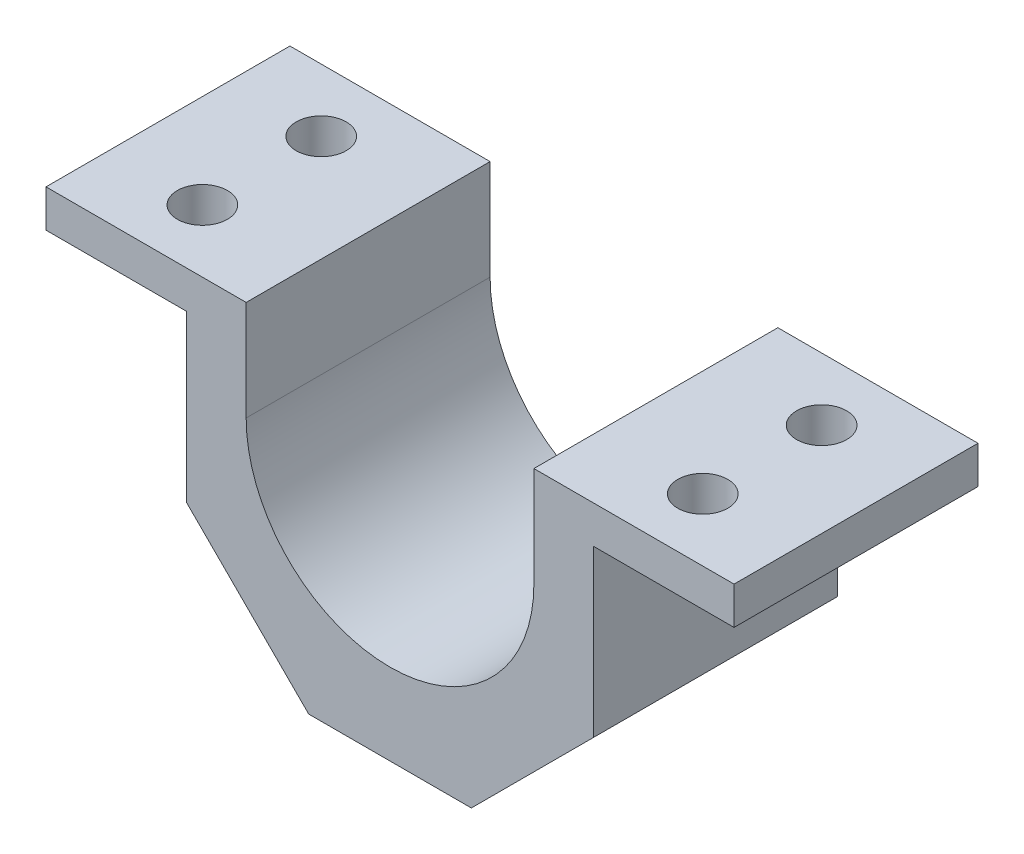
ISO-10303-21;
HEADER;
FILE_DESCRIPTION(('STEP AP214'),'2;1');
FILE_NAME('part.step','',(''),(''),'','','');
FILE_SCHEMA(('AUTOMOTIVE_DESIGN { 1 0 10303 214 1 1 1 1 }'));
ENDSEC;
DATA;
#1=APPLICATION_CONTEXT('core data for automotive mechanical design processes');
#2=APPLICATION_PROTOCOL_DEFINITION('international standard','automotive_design',2000,#1);
#3=PRODUCT_CONTEXT('',#1,'mechanical');
#4=PRODUCT('Part','Part','',(#3));
#5=PRODUCT_RELATED_PRODUCT_CATEGORY('part','',(#4));
#6=PRODUCT_DEFINITION_FORMATION('','',#4);
#7=PRODUCT_DEFINITION_CONTEXT('part definition',#1,'design');
#8=PRODUCT_DEFINITION('design','',#6,#7);
#9=PRODUCT_DEFINITION_SHAPE('','',#8);
#10=(LENGTH_UNIT() NAMED_UNIT(*) SI_UNIT(.MILLI.,.METRE.));
#11=(NAMED_UNIT(*) PLANE_ANGLE_UNIT() SI_UNIT($,.RADIAN.));
#12=(NAMED_UNIT(*) SI_UNIT($,.STERADIAN.) SOLID_ANGLE_UNIT());
#13=UNCERTAINTY_MEASURE_WITH_UNIT(LENGTH_MEASURE(1.E-05),#10,'distance_accuracy_value','');
#14=(GEOMETRIC_REPRESENTATION_CONTEXT(3) GLOBAL_UNCERTAINTY_ASSIGNED_CONTEXT((#13)) GLOBAL_UNIT_ASSIGNED_CONTEXT((#10,
#11,#12)) REPRESENTATION_CONTEXT('',''));
#15=CARTESIAN_POINT('',(0.,0.,0.));
#16=DIRECTION('',(0.,0.,1.));
#17=DIRECTION('',(1.,0.,0.));
#18=AXIS2_PLACEMENT_3D('',#15,#16,#17);
#19=CARTESIAN_POINT('',(0.,0.,19.5));
#20=DIRECTION('',(0.,0.,-1.));
#21=DIRECTION('',(-1.,0.,0.));
#22=AXIS2_PLACEMENT_3D('',#19,#20,#21);
#23=CYLINDRICAL_SURFACE('',#22,23.);
#24=CARTESIAN_POINT('',(0.,0.,-19.5));
#25=DIRECTION('',(0.,0.,1.));
#26=DIRECTION('',(1.,0.,0.));
#27=AXIS2_PLACEMENT_3D('',#24,#25,#26);
#28=CIRCLE('',#27,23.);
#29=CARTESIAN_POINT('',(-23.,0.,-19.5));
#30=VERTEX_POINT('',#29);
#31=CARTESIAN_POINT('',(23.,0.,-19.5));
#32=VERTEX_POINT('',#31);
#33=EDGE_CURVE('E166',#30,#32,#28,.T.);
#34=ORIENTED_EDGE('',*,*,#33,.F.);
#35=DIRECTION('',(0.,0.,-1.));
#36=VECTOR('',#35,1.);
#37=CARTESIAN_POINT('',(-23.,0.,19.5));
#38=LINE('',#37,#36);
#39=CARTESIAN_POINT('',(-23.,0.,19.5));
#40=VERTEX_POINT('',#39);
#41=EDGE_CURVE('E11',#40,#30,#38,.T.);
#42=ORIENTED_EDGE('',*,*,#41,.F.);
#43=CARTESIAN_POINT('',(0.,0.,19.5));
#44=DIRECTION('',(0.,0.,1.));
#45=DIRECTION('',(1.,0.,0.));
#46=AXIS2_PLACEMENT_3D('',#43,#44,#45);
#47=CIRCLE('',#46,23.);
#48=CARTESIAN_POINT('',(23.,0.,19.5));
#49=VERTEX_POINT('',#48);
#50=EDGE_CURVE('E199',#40,#49,#47,.T.);
#51=ORIENTED_EDGE('',*,*,#50,.T.);
#52=DIRECTION('',(0.,0.,-1.));
#53=VECTOR('',#52,1.);
#54=CARTESIAN_POINT('',(23.,0.,19.5));
#55=LINE('',#54,#53);
#56=EDGE_CURVE('E109',#49,#32,#55,.T.);
#57=ORIENTED_EDGE('',*,*,#56,.T.);
#58=EDGE_LOOP('',(#34,#42,#51,#57));
#59=FACE_BOUND('',#58,.T.);
#60=ADVANCED_FACE('F39',(#59),#23,.F.);
#61=CARTESIAN_POINT('',(-23.,0.,19.5));
#62=DIRECTION('',(1.,0.,0.));
#63=DIRECTION('',(0.,0.,-1.));
#64=AXIS2_PLACEMENT_3D('',#61,#62,#63);
#65=PLANE('',#64);
#66=DIRECTION('',(0.,-1.,0.));
#67=VECTOR('',#66,1.);
#68=CARTESIAN_POINT('',(-23.,0.,-19.5));
#69=LINE('',#68,#67);
#70=CARTESIAN_POINT('',(-23.,16.,-19.5));
#71=VERTEX_POINT('',#70);
#72=EDGE_CURVE('E171',#71,#30,#69,.T.);
#73=ORIENTED_EDGE('',*,*,#72,.F.);
#74=DIRECTION('',(0.,0.,-1.));
#75=VECTOR('',#74,1.);
#76=CARTESIAN_POINT('',(-23.,16.,19.5));
#77=LINE('',#76,#75);
#78=CARTESIAN_POINT('',(-23.,16.,19.5));
#79=VERTEX_POINT('',#78);
#80=EDGE_CURVE('E48',#79,#71,#77,.T.);
#81=ORIENTED_EDGE('',*,*,#80,.F.);
#82=DIRECTION('',(0.,-1.,0.));
#83=VECTOR('',#82,1.);
#84=CARTESIAN_POINT('',(-23.,0.,19.5));
#85=LINE('',#84,#83);
#86=EDGE_CURVE('E241',#79,#40,#85,.T.);
#87=ORIENTED_EDGE('',*,*,#86,.T.);
#88=ORIENTED_EDGE('',*,*,#41,.T.);
#89=EDGE_LOOP('',(#73,#81,#87,#88));
#90=FACE_BOUND('',#89,.T.);
#91=ADVANCED_FACE('F278',(#90),#65,.T.);
#92=CARTESIAN_POINT('',(0.,16.,19.5));
#93=DIRECTION('',(0.,1.,0.));
#94=DIRECTION('',(-1.,0.,0.));
#95=AXIS2_PLACEMENT_3D('',#92,#93,#94);
#96=PLANE('',#95);
#97=CARTESIAN_POINT('',(-40.,16.,-9.5));
#98=DIRECTION('',(0.,1.,0.));
#99=DIRECTION('',(1.,0.,0.));
#100=AXIS2_PLACEMENT_3D('',#97,#98,#99);
#101=CIRCLE('',#100,4.00000000000001);
#102=CARTESIAN_POINT('',(-36.,16.,-9.5));
#103=VERTEX_POINT('',#102);
#104=EDGE_CURVE('E454',#103,#103,#101,.T.);
#105=ORIENTED_EDGE('',*,*,#104,.F.);
#106=EDGE_LOOP('',(#105));
#107=FACE_BOUND('',#106,.T.);
#108=CARTESIAN_POINT('',(-40.,16.,9.5));
#109=DIRECTION('',(0.,1.,0.));
#110=DIRECTION('',(-1.,0.,0.));
#111=AXIS2_PLACEMENT_3D('',#108,#109,#110);
#112=CIRCLE('',#111,4.00000000000001);
#113=CARTESIAN_POINT('',(-44.,16.,9.5));
#114=VERTEX_POINT('',#113);
#115=EDGE_CURVE('E459',#114,#114,#112,.T.);
#116=ORIENTED_EDGE('',*,*,#115,.F.);
#117=EDGE_LOOP('',(#116));
#118=FACE_BOUND('',#117,.T.);
#119=DIRECTION('',(1.,0.,0.));
#120=VECTOR('',#119,1.);
#121=CARTESIAN_POINT('',(0.,16.,-19.5));
#122=LINE('',#121,#120);
#123=CARTESIAN_POINT('',(-55.,16.,-19.5));
#124=VERTEX_POINT('',#123);
#125=EDGE_CURVE('E172',#124,#71,#122,.T.);
#126=ORIENTED_EDGE('',*,*,#125,.F.);
#127=DIRECTION('',(0.,0.,-1.));
#128=VECTOR('',#127,1.);
#129=CARTESIAN_POINT('',(-55.,16.,19.5));
#130=LINE('',#129,#128);
#131=CARTESIAN_POINT('',(-55.,16.,19.5));
#132=VERTEX_POINT('',#131);
#133=EDGE_CURVE('E224',#132,#124,#130,.T.);
#134=ORIENTED_EDGE('',*,*,#133,.F.);
#135=DIRECTION('',(1.,0.,0.));
#136=VECTOR('',#135,1.);
#137=CARTESIAN_POINT('',(0.,16.,19.5));
#138=LINE('',#137,#136);
#139=EDGE_CURVE('E242',#132,#79,#138,.T.);
#140=ORIENTED_EDGE('',*,*,#139,.T.);
#141=ORIENTED_EDGE('',*,*,#80,.T.);
#142=EDGE_LOOP('',(#126,#134,#140,#141));
#143=FACE_BOUND('',#142,.T.);
#144=ADVANCED_FACE('F285',(#107,#118,#143),#96,.T.);
#145=CARTESIAN_POINT('',(-55.,0.,19.5));
#146=DIRECTION('',(1.,0.,0.));
#147=DIRECTION('',(0.,0.,-1.));
#148=AXIS2_PLACEMENT_3D('',#145,#146,#147);
#149=PLANE('',#148);
#150=DIRECTION('',(0.,-1.,0.));
#151=VECTOR('',#150,1.);
#152=CARTESIAN_POINT('',(-55.,0.,-19.5));
#153=LINE('',#152,#151);
#154=CARTESIAN_POINT('',(-55.,10.,-19.5));
#155=VERTEX_POINT('',#154);
#156=EDGE_CURVE('E179',#124,#155,#153,.T.);
#157=ORIENTED_EDGE('',*,*,#156,.T.);
#158=DIRECTION('',(0.,0.,-1.));
#159=VECTOR('',#158,1.);
#160=CARTESIAN_POINT('',(-55.,10.,19.5));
#161=LINE('',#160,#159);
#162=CARTESIAN_POINT('',(-55.,10.,19.5));
#163=VERTEX_POINT('',#162);
#164=EDGE_CURVE('E219',#163,#155,#161,.T.);
#165=ORIENTED_EDGE('',*,*,#164,.F.);
#166=DIRECTION('',(0.,-1.,0.));
#167=VECTOR('',#166,1.);
#168=CARTESIAN_POINT('',(-55.,0.,19.5));
#169=LINE('',#168,#167);
#170=EDGE_CURVE('E249',#132,#163,#169,.T.);
#171=ORIENTED_EDGE('',*,*,#170,.F.);
#172=ORIENTED_EDGE('',*,*,#133,.T.);
#173=EDGE_LOOP('',(#157,#165,#171,#172));
#174=FACE_BOUND('',#173,.T.);
#175=ADVANCED_FACE('F288',(#174),#149,.F.);
#176=CARTESIAN_POINT('',(0.,9.99999999999997,19.5));
#177=DIRECTION('',(0.,1.,0.));
#178=DIRECTION('',(-1.,0.,0.));
#179=AXIS2_PLACEMENT_3D('',#176,#177,#178);
#180=PLANE('',#179);
#181=CARTESIAN_POINT('',(-40.,9.99999999999999,-9.5));
#182=DIRECTION('',(0.,1.,0.));
#183=DIRECTION('',(-1.,0.,0.));
#184=AXIS2_PLACEMENT_3D('',#181,#182,#183);
#185=CIRCLE('',#184,4.00000000000001);
#186=CARTESIAN_POINT('',(-44.,9.99999999999999,-9.5));
#187=VERTEX_POINT('',#186);
#188=EDGE_CURVE('E45',#187,#187,#185,.T.);
#189=ORIENTED_EDGE('',*,*,#188,.T.);
#190=EDGE_LOOP('',(#189));
#191=FACE_BOUND('',#190,.T.);
#192=CARTESIAN_POINT('',(-40.,9.99999999999999,9.5));
#193=DIRECTION('',(0.,1.,0.));
#194=DIRECTION('',(-1.,0.,0.));
#195=AXIS2_PLACEMENT_3D('',#192,#193,#194);
#196=CIRCLE('',#195,4.00000000000001);
#197=CARTESIAN_POINT('',(-44.,9.99999999999999,9.5));
#198=VERTEX_POINT('',#197);
#199=EDGE_CURVE('E223',#198,#198,#196,.T.);
#200=ORIENTED_EDGE('',*,*,#199,.T.);
#201=EDGE_LOOP('',(#200));
#202=FACE_BOUND('',#201,.T.);
#203=DIRECTION('',(1.,0.,0.));
#204=VECTOR('',#203,1.);
#205=CARTESIAN_POINT('',(0.,9.99999999999997,-19.5));
#206=LINE('',#205,#204);
#207=CARTESIAN_POINT('',(-32.5,9.99999999999999,-19.5));
#208=VERTEX_POINT('',#207);
#209=EDGE_CURVE('E180',#155,#208,#206,.T.);
#210=ORIENTED_EDGE('',*,*,#209,.T.);
#211=DIRECTION('',(0.,0.,-1.));
#212=VECTOR('',#211,1.);
#213=CARTESIAN_POINT('',(-32.5,9.99999999999999,19.5));
#214=LINE('',#213,#212);
#215=CARTESIAN_POINT('',(-32.5,9.99999999999999,19.5));
#216=VERTEX_POINT('',#215);
#217=EDGE_CURVE('E220',#216,#208,#214,.T.);
#218=ORIENTED_EDGE('',*,*,#217,.F.);
#219=DIRECTION('',(1.,0.,0.));
#220=VECTOR('',#219,1.);
#221=CARTESIAN_POINT('',(0.,9.99999999999997,19.5));
#222=LINE('',#221,#220);
#223=EDGE_CURVE('E250',#163,#216,#222,.T.);
#224=ORIENTED_EDGE('',*,*,#223,.F.);
#225=ORIENTED_EDGE('',*,*,#164,.T.);
#226=EDGE_LOOP('',(#210,#218,#224,#225));
#227=FACE_BOUND('',#226,.T.);
#228=ADVANCED_FACE('F291',(#191,#202,#227),#180,.F.);
#229=CARTESIAN_POINT('',(-32.5,0.,19.5));
#230=DIRECTION('',(1.,0.,0.));
#231=DIRECTION('',(0.,1.,0.));
#232=AXIS2_PLACEMENT_3D('',#229,#230,#231);
#233=PLANE('',#232);
#234=DIRECTION('',(0.,-1.,0.));
#235=VECTOR('',#234,1.);
#236=CARTESIAN_POINT('',(-32.5,0.,-19.5));
#237=LINE('',#236,#235);
#238=CARTESIAN_POINT('',(-32.5,-16.5000000000002,-19.5));
#239=VERTEX_POINT('',#238);
#240=EDGE_CURVE('E185',#208,#239,#237,.T.);
#241=ORIENTED_EDGE('',*,*,#240,.T.);
#242=DIRECTION('',(0.,0.,-1.));
#243=VECTOR('',#242,1.);
#244=CARTESIAN_POINT('',(-32.5,-16.5000000000002,19.5));
#245=LINE('',#244,#243);
#246=CARTESIAN_POINT('',(-32.5,-16.5000000000002,19.5));
#247=VERTEX_POINT('',#246);
#248=EDGE_CURVE('E212',#247,#239,#245,.T.);
#249=ORIENTED_EDGE('',*,*,#248,.F.);
#250=DIRECTION('',(0.,-1.,0.));
#251=VECTOR('',#250,1.);
#252=CARTESIAN_POINT('',(-32.5,0.,19.5));
#253=LINE('',#252,#251);
#254=EDGE_CURVE('E252',#216,#247,#253,.T.);
#255=ORIENTED_EDGE('',*,*,#254,.F.);
#256=ORIENTED_EDGE('',*,*,#217,.T.);
#257=EDGE_LOOP('',(#241,#249,#255,#256));
#258=FACE_BOUND('',#257,.T.);
#259=ADVANCED_FACE('F300',(#258),#233,.F.);
#260=CARTESIAN_POINT('',(-24.4999999999999,-24.5000000000002,19.5));
#261=DIRECTION('',(0.707106781186544,0.707106781186551,0.));
#262=DIRECTION('',(-0.707106781186551,0.707106781186544,0.));
#263=AXIS2_PLACEMENT_3D('',#260,#261,#262);
#264=PLANE('',#263);
#265=DIRECTION('',(0.707106781186551,-0.707106781186544,0.));
#266=VECTOR('',#265,1.);
#267=CARTESIAN_POINT('',(-24.4999999999999,-24.5000000000002,-19.5));
#268=LINE('',#267,#266);
#269=CARTESIAN_POINT('',(-13.,-36.,-19.5));
#270=VERTEX_POINT('',#269);
#271=EDGE_CURVE('E184',#239,#270,#268,.T.);
#272=ORIENTED_EDGE('',*,*,#271,.T.);
#273=DIRECTION('',(0.,0.,-1.));
#274=VECTOR('',#273,1.);
#275=CARTESIAN_POINT('',(-13.,-36.,19.5));
#276=LINE('',#275,#274);
#277=CARTESIAN_POINT('',(-13.,-36.,19.5));
#278=VERTEX_POINT('',#277);
#279=EDGE_CURVE('E211',#278,#270,#276,.T.);
#280=ORIENTED_EDGE('',*,*,#279,.F.);
#281=DIRECTION('',(0.707106781186551,-0.707106781186544,0.));
#282=VECTOR('',#281,1.);
#283=CARTESIAN_POINT('',(-24.4999999999999,-24.5000000000002,19.5));
#284=LINE('',#283,#282);
#285=EDGE_CURVE('E255',#247,#278,#284,.T.);
#286=ORIENTED_EDGE('',*,*,#285,.F.);
#287=ORIENTED_EDGE('',*,*,#248,.T.);
#288=EDGE_LOOP('',(#272,#280,#286,#287));
#289=FACE_BOUND('',#288,.T.);
#290=ADVANCED_FACE('F303',(#289),#264,.F.);
#291=CARTESIAN_POINT('',(0.,-36.,19.5));
#292=DIRECTION('',(0.,1.,0.));
#293=DIRECTION('',(-1.,0.,0.));
#294=AXIS2_PLACEMENT_3D('',#291,#292,#293);
#295=PLANE('',#294);
#296=DIRECTION('',(1.,0.,0.));
#297=VECTOR('',#296,1.);
#298=CARTESIAN_POINT('',(0.,-36.,-19.5));
#299=LINE('',#298,#297);
#300=CARTESIAN_POINT('',(13.,-36.,-19.5));
#301=VERTEX_POINT('',#300);
#302=EDGE_CURVE('E189',#270,#301,#299,.T.);
#303=ORIENTED_EDGE('',*,*,#302,.T.);
#304=DIRECTION('',(0.,0.,-1.));
#305=VECTOR('',#304,1.);
#306=CARTESIAN_POINT('',(13.,-36.,19.5));
#307=LINE('',#306,#305);
#308=CARTESIAN_POINT('',(13.,-36.,19.5));
#309=VERTEX_POINT('',#308);
#310=EDGE_CURVE('E207',#309,#301,#307,.T.);
#311=ORIENTED_EDGE('',*,*,#310,.F.);
#312=DIRECTION('',(1.,0.,0.));
#313=VECTOR('',#312,1.);
#314=CARTESIAN_POINT('',(0.,-36.,19.5));
#315=LINE('',#314,#313);
#316=EDGE_CURVE('E258',#278,#309,#315,.T.);
#317=ORIENTED_EDGE('',*,*,#316,.F.);
#318=ORIENTED_EDGE('',*,*,#279,.T.);
#319=EDGE_LOOP('',(#303,#311,#317,#318));
#320=FACE_BOUND('',#319,.T.);
#321=ADVANCED_FACE('F306',(#320),#295,.F.);
#322=CARTESIAN_POINT('',(24.4999999999999,-24.5000000000002,19.5));
#323=DIRECTION('',(0.707106781186544,-0.707106781186551,0.));
#324=DIRECTION('',(0.707106781186551,0.707106781186544,0.));
#325=AXIS2_PLACEMENT_3D('',#322,#323,#324);
#326=PLANE('',#325);
#327=DIRECTION('',(-0.707106781186551,-0.707106781186544,0.));
#328=VECTOR('',#327,1.);
#329=CARTESIAN_POINT('',(24.4999999999999,-24.5000000000002,-19.5));
#330=LINE('',#329,#328);
#331=CARTESIAN_POINT('',(32.5,-16.5000000000002,-19.5));
#332=VERTEX_POINT('',#331);
#333=EDGE_CURVE('E188',#332,#301,#330,.T.);
#334=ORIENTED_EDGE('',*,*,#333,.F.);
#335=DIRECTION('',(0.,0.,-1.));
#336=VECTOR('',#335,1.);
#337=CARTESIAN_POINT('',(32.5,-16.5000000000002,19.5));
#338=LINE('',#337,#336);
#339=CARTESIAN_POINT('',(32.5,-16.5000000000002,19.5));
#340=VERTEX_POINT('',#339);
#341=EDGE_CURVE('E210',#340,#332,#338,.T.);
#342=ORIENTED_EDGE('',*,*,#341,.F.);
#343=DIRECTION('',(-0.707106781186551,-0.707106781186544,0.));
#344=VECTOR('',#343,1.);
#345=CARTESIAN_POINT('',(24.4999999999999,-24.5000000000002,19.5));
#346=LINE('',#345,#344);
#347=EDGE_CURVE('E256',#340,#309,#346,.T.);
#348=ORIENTED_EDGE('',*,*,#347,.T.);
#349=ORIENTED_EDGE('',*,*,#310,.T.);
#350=EDGE_LOOP('',(#334,#342,#348,#349));
#351=FACE_BOUND('',#350,.T.);
#352=ADVANCED_FACE('F313',(#351),#326,.T.);
#353=CARTESIAN_POINT('',(32.5,0.,19.5));
#354=DIRECTION('',(-1.,0.,0.));
#355=DIRECTION('',(0.,-1.,0.));
#356=AXIS2_PLACEMENT_3D('',#353,#354,#355);
#357=PLANE('',#356);
#358=DIRECTION('',(0.,1.,0.));
#359=VECTOR('',#358,1.);
#360=CARTESIAN_POINT('',(32.5,0.,-19.5));
#361=LINE('',#360,#359);
#362=CARTESIAN_POINT('',(32.5,10.,-19.5));
#363=VERTEX_POINT('',#362);
#364=EDGE_CURVE('E192',#332,#363,#361,.T.);
#365=ORIENTED_EDGE('',*,*,#364,.T.);
#366=DIRECTION('',(0.,0.,-1.));
#367=VECTOR('',#366,1.);
#368=CARTESIAN_POINT('',(32.5,10.,19.5));
#369=LINE('',#368,#367);
#370=CARTESIAN_POINT('',(32.5,10.,19.5));
#371=VERTEX_POINT('',#370);
#372=EDGE_CURVE('E204',#371,#363,#369,.T.);
#373=ORIENTED_EDGE('',*,*,#372,.F.);
#374=DIRECTION('',(0.,1.,0.));
#375=VECTOR('',#374,1.);
#376=CARTESIAN_POINT('',(32.5,0.,19.5));
#377=LINE('',#376,#375);
#378=EDGE_CURVE('E261',#340,#371,#377,.T.);
#379=ORIENTED_EDGE('',*,*,#378,.F.);
#380=ORIENTED_EDGE('',*,*,#341,.T.);
#381=EDGE_LOOP('',(#365,#373,#379,#380));
#382=FACE_BOUND('',#381,.T.);
#383=ADVANCED_FACE('F266',(#382),#357,.F.);
#384=CARTESIAN_POINT('',(0.,9.99999999999999,19.5));
#385=DIRECTION('',(0.,1.,0.));
#386=DIRECTION('',(-1.,0.,0.));
#387=AXIS2_PLACEMENT_3D('',#384,#385,#386);
#388=PLANE('',#387);
#389=CARTESIAN_POINT('',(40.,10.,9.5));
#390=DIRECTION('',(0.,1.,0.));
#391=DIRECTION('',(-1.,0.,0.));
#392=AXIS2_PLACEMENT_3D('',#389,#390,#391);
#393=CIRCLE('',#392,4.00000000000001);
#394=CARTESIAN_POINT('',(36.,10.,9.5));
#395=VERTEX_POINT('',#394);
#396=EDGE_CURVE('E226',#395,#395,#393,.T.);
#397=ORIENTED_EDGE('',*,*,#396,.T.);
#398=EDGE_LOOP('',(#397));
#399=FACE_BOUND('',#398,.T.);
#400=CARTESIAN_POINT('',(40.,10.,-9.5));
#401=DIRECTION('',(0.,1.,0.));
#402=DIRECTION('',(-1.,0.,0.));
#403=AXIS2_PLACEMENT_3D('',#400,#401,#402);
#404=CIRCLE('',#403,4.00000000000001);
#405=CARTESIAN_POINT('',(36.,10.,-9.5));
#406=VERTEX_POINT('',#405);
#407=EDGE_CURVE('E232',#406,#406,#404,.T.);
#408=ORIENTED_EDGE('',*,*,#407,.T.);
#409=EDGE_LOOP('',(#408));
#410=FACE_BOUND('',#409,.T.);
#411=DIRECTION('',(1.,0.,0.));
#412=VECTOR('',#411,1.);
#413=CARTESIAN_POINT('',(0.,9.99999999999999,-19.5));
#414=LINE('',#413,#412);
#415=CARTESIAN_POINT('',(55.,10.,-19.5));
#416=VERTEX_POINT('',#415);
#417=EDGE_CURVE('E193',#363,#416,#414,.T.);
#418=ORIENTED_EDGE('',*,*,#417,.T.);
#419=DIRECTION('',(0.,0.,-1.));
#420=VECTOR('',#419,1.);
#421=CARTESIAN_POINT('',(55.,10.,19.5));
#422=LINE('',#421,#420);
#423=CARTESIAN_POINT('',(55.,10.,19.5));
#424=VERTEX_POINT('',#423);
#425=EDGE_CURVE('E161',#424,#416,#422,.T.);
#426=ORIENTED_EDGE('',*,*,#425,.F.);
#427=DIRECTION('',(1.,0.,0.));
#428=VECTOR('',#427,1.);
#429=CARTESIAN_POINT('',(0.,9.99999999999999,19.5));
#430=LINE('',#429,#428);
#431=EDGE_CURVE('E155',#371,#424,#430,.T.);
#432=ORIENTED_EDGE('',*,*,#431,.F.);
#433=ORIENTED_EDGE('',*,*,#372,.T.);
#434=EDGE_LOOP('',(#418,#426,#432,#433));
#435=FACE_BOUND('',#434,.T.);
#436=ADVANCED_FACE('F269',(#399,#410,#435),#388,.F.);
#437=CARTESIAN_POINT('',(55.,0.,19.5));
#438=DIRECTION('',(-1.,0.,0.));
#439=DIRECTION('',(0.,-1.,0.));
#440=AXIS2_PLACEMENT_3D('',#437,#438,#439);
#441=PLANE('',#440);
#442=DIRECTION('',(0.,1.,0.));
#443=VECTOR('',#442,1.);
#444=CARTESIAN_POINT('',(55.,0.,-19.5));
#445=LINE('',#444,#443);
#446=CARTESIAN_POINT('',(55.,16.,-19.5));
#447=VERTEX_POINT('',#446);
#448=EDGE_CURVE('E159',#416,#447,#445,.T.);
#449=ORIENTED_EDGE('',*,*,#448,.T.);
#450=DIRECTION('',(0.,0.,-1.));
#451=VECTOR('',#450,1.);
#452=CARTESIAN_POINT('',(55.,16.,19.5));
#453=LINE('',#452,#451);
#454=CARTESIAN_POINT('',(55.,16.,19.5));
#455=VERTEX_POINT('',#454);
#456=EDGE_CURVE('E160',#455,#447,#453,.T.);
#457=ORIENTED_EDGE('',*,*,#456,.F.);
#458=DIRECTION('',(0.,1.,0.));
#459=VECTOR('',#458,1.);
#460=CARTESIAN_POINT('',(55.,0.,19.5));
#461=LINE('',#460,#459);
#462=EDGE_CURVE('E148',#424,#455,#461,.T.);
#463=ORIENTED_EDGE('',*,*,#462,.F.);
#464=ORIENTED_EDGE('',*,*,#425,.T.);
#465=EDGE_LOOP('',(#449,#457,#463,#464));
#466=FACE_BOUND('',#465,.T.);
#467=ADVANCED_FACE('F158',(#466),#441,.F.);
#468=CARTESIAN_POINT('',(0.,16.,19.5));
#469=DIRECTION('',(0.,-1.,0.));
#470=DIRECTION('',(1.,0.,0.));
#471=AXIS2_PLACEMENT_3D('',#468,#469,#470);
#472=PLANE('',#471);
#473=CARTESIAN_POINT('',(40.,16.,9.5));
#474=DIRECTION('',(0.,1.,0.));
#475=DIRECTION('',(1.,0.,0.));
#476=AXIS2_PLACEMENT_3D('',#473,#474,#475);
#477=CIRCLE('',#476,4.00000000000001);
#478=CARTESIAN_POINT('',(44.,16.,9.5));
#479=VERTEX_POINT('',#478);
#480=EDGE_CURVE('E455',#479,#479,#477,.T.);
#481=ORIENTED_EDGE('',*,*,#480,.F.);
#482=EDGE_LOOP('',(#481));
#483=FACE_BOUND('',#482,.T.);
#484=CARTESIAN_POINT('',(40.,16.,-9.5));
#485=DIRECTION('',(0.,1.,0.));
#486=DIRECTION('',(-1.,0.,0.));
#487=AXIS2_PLACEMENT_3D('',#484,#485,#486);
#488=CIRCLE('',#487,4.00000000000001);
#489=CARTESIAN_POINT('',(36.,16.,-9.5));
#490=VERTEX_POINT('',#489);
#491=EDGE_CURVE('E240',#490,#490,#488,.T.);
#492=ORIENTED_EDGE('',*,*,#491,.F.);
#493=EDGE_LOOP('',(#492));
#494=FACE_BOUND('',#493,.T.);
#495=DIRECTION('',(-1.,0.,0.));
#496=VECTOR('',#495,1.);
#497=CARTESIAN_POINT('',(0.,16.,-19.5));
#498=LINE('',#497,#496);
#499=CARTESIAN_POINT('',(23.,16.,-19.5));
#500=VERTEX_POINT('',#499);
#501=EDGE_CURVE('E103',#447,#500,#498,.T.);
#502=ORIENTED_EDGE('',*,*,#501,.T.);
#503=DIRECTION('',(0.,0.,-1.));
#504=VECTOR('',#503,1.);
#505=CARTESIAN_POINT('',(23.,16.,19.5));
#506=LINE('',#505,#504);
#507=CARTESIAN_POINT('',(23.,16.,19.5));
#508=VERTEX_POINT('',#507);
#509=EDGE_CURVE('E165',#508,#500,#506,.T.);
#510=ORIENTED_EDGE('',*,*,#509,.F.);
#511=DIRECTION('',(-1.,0.,0.));
#512=VECTOR('',#511,1.);
#513=CARTESIAN_POINT('',(0.,16.,19.5));
#514=LINE('',#513,#512);
#515=EDGE_CURVE('E147',#455,#508,#514,.T.);
#516=ORIENTED_EDGE('',*,*,#515,.F.);
#517=ORIENTED_EDGE('',*,*,#456,.T.);
#518=EDGE_LOOP('',(#502,#510,#516,#517));
#519=FACE_BOUND('',#518,.T.);
#520=ADVANCED_FACE('F163',(#483,#494,#519),#472,.F.);
#521=CARTESIAN_POINT('',(23.,0.,19.5));
#522=DIRECTION('',(1.,0.,0.));
#523=DIRECTION('',(0.,1.,0.));
#524=AXIS2_PLACEMENT_3D('',#521,#522,#523);
#525=PLANE('',#524);
#526=DIRECTION('',(0.,-1.,0.));
#527=VECTOR('',#526,1.);
#528=CARTESIAN_POINT('',(23.,0.,-19.5));
#529=LINE('',#528,#527);
#530=EDGE_CURVE('E196',#500,#32,#529,.T.);
#531=ORIENTED_EDGE('',*,*,#530,.T.);
#532=ORIENTED_EDGE('',*,*,#56,.F.);
#533=DIRECTION('',(0.,-1.,0.));
#534=VECTOR('',#533,1.);
#535=CARTESIAN_POINT('',(23.,0.,19.5));
#536=LINE('',#535,#534);
#537=EDGE_CURVE('E60',#508,#49,#536,.T.);
#538=ORIENTED_EDGE('',*,*,#537,.F.);
#539=ORIENTED_EDGE('',*,*,#509,.T.);
#540=EDGE_LOOP('',(#531,#532,#538,#539));
#541=FACE_BOUND('',#540,.T.);
#542=ADVANCED_FACE('F274',(#541),#525,.F.);
#543=CARTESIAN_POINT('',(0.,0.,19.5));
#544=DIRECTION('',(0.,0.,1.));
#545=DIRECTION('',(1.,0.,0.));
#546=AXIS2_PLACEMENT_3D('',#543,#544,#545);
#547=PLANE('',#546);
#548=ORIENTED_EDGE('',*,*,#50,.F.);
#549=ORIENTED_EDGE('',*,*,#86,.F.);
#550=ORIENTED_EDGE('',*,*,#139,.F.);
#551=ORIENTED_EDGE('',*,*,#170,.T.);
#552=ORIENTED_EDGE('',*,*,#223,.T.);
#553=ORIENTED_EDGE('',*,*,#254,.T.);
#554=ORIENTED_EDGE('',*,*,#285,.T.);
#555=ORIENTED_EDGE('',*,*,#316,.T.);
#556=ORIENTED_EDGE('',*,*,#347,.F.);
#557=ORIENTED_EDGE('',*,*,#378,.T.);
#558=ORIENTED_EDGE('',*,*,#431,.T.);
#559=ORIENTED_EDGE('',*,*,#462,.T.);
#560=ORIENTED_EDGE('',*,*,#515,.T.);
#561=ORIENTED_EDGE('',*,*,#537,.T.);
#562=EDGE_LOOP('',(#548,#549,#550,#551,#552,#553,#554,#555,#556,#557,#558,#559,#560,#561));
#563=FACE_BOUND('',#562,.T.);
#564=ADVANCED_FACE('F146',(#563),#547,.T.);
#565=CARTESIAN_POINT('',(0.,0.,-19.5));
#566=DIRECTION('',(0.,0.,1.));
#567=DIRECTION('',(1.,0.,0.));
#568=AXIS2_PLACEMENT_3D('',#565,#566,#567);
#569=PLANE('',#568);
#570=ORIENTED_EDGE('',*,*,#33,.T.);
#571=ORIENTED_EDGE('',*,*,#530,.F.);
#572=ORIENTED_EDGE('',*,*,#501,.F.);
#573=ORIENTED_EDGE('',*,*,#448,.F.);
#574=ORIENTED_EDGE('',*,*,#417,.F.);
#575=ORIENTED_EDGE('',*,*,#364,.F.);
#576=ORIENTED_EDGE('',*,*,#333,.T.);
#577=ORIENTED_EDGE('',*,*,#302,.F.);
#578=ORIENTED_EDGE('',*,*,#271,.F.);
#579=ORIENTED_EDGE('',*,*,#240,.F.);
#580=ORIENTED_EDGE('',*,*,#209,.F.);
#581=ORIENTED_EDGE('',*,*,#156,.F.);
#582=ORIENTED_EDGE('',*,*,#125,.T.);
#583=ORIENTED_EDGE('',*,*,#72,.T.);
#584=EDGE_LOOP('',(#570,#571,#572,#573,#574,#575,#576,#577,#578,#579,#580,#581,#582,#583));
#585=FACE_BOUND('',#584,.T.);
#586=ADVANCED_FACE('F275',(#585),#569,.F.);
#587=CARTESIAN_POINT('',(40.,-3.99999999999999,-9.5));
#588=DIRECTION('',(0.,1.,0.));
#589=DIRECTION('',(-1.,0.,0.));
#590=AXIS2_PLACEMENT_3D('',#587,#588,#589);
#591=CYLINDRICAL_SURFACE('',#590,4.00000000000001);
#592=ORIENTED_EDGE('',*,*,#491,.T.);
#593=EDGE_LOOP('',(#592));
#594=FACE_BOUND('',#593,.T.);
#595=ORIENTED_EDGE('',*,*,#407,.F.);
#596=EDGE_LOOP('',(#595));
#597=FACE_BOUND('',#596,.T.);
#598=ADVANCED_FACE('F408',(#594,#597),#591,.F.);
#599=CARTESIAN_POINT('',(40.,-3.99999999999999,9.5));
#600=DIRECTION('',(0.,1.,0.));
#601=DIRECTION('',(-1.,0.,0.));
#602=AXIS2_PLACEMENT_3D('',#599,#600,#601);
#603=CYLINDRICAL_SURFACE('',#602,4.00000000000001);
#604=ORIENTED_EDGE('',*,*,#480,.T.);
#605=EDGE_LOOP('',(#604));
#606=FACE_BOUND('',#605,.T.);
#607=ORIENTED_EDGE('',*,*,#396,.F.);
#608=EDGE_LOOP('',(#607));
#609=FACE_BOUND('',#608,.T.);
#610=ADVANCED_FACE('F417',(#606,#609),#603,.F.);
#611=CARTESIAN_POINT('',(-40.,-4.00000000000003,9.5));
#612=DIRECTION('',(0.,1.,0.));
#613=DIRECTION('',(-1.,0.,0.));
#614=AXIS2_PLACEMENT_3D('',#611,#612,#613);
#615=CYLINDRICAL_SURFACE('',#614,4.00000000000001);
#616=ORIENTED_EDGE('',*,*,#115,.T.);
#617=EDGE_LOOP('',(#616));
#618=FACE_BOUND('',#617,.T.);
#619=ORIENTED_EDGE('',*,*,#199,.F.);
#620=EDGE_LOOP('',(#619));
#621=FACE_BOUND('',#620,.T.);
#622=ADVANCED_FACE('F430',(#618,#621),#615,.F.);
#623=CARTESIAN_POINT('',(-40.,-4.00000000000003,-9.5));
#624=DIRECTION('',(0.,1.,0.));
#625=DIRECTION('',(-1.,0.,0.));
#626=AXIS2_PLACEMENT_3D('',#623,#624,#625);
#627=CYLINDRICAL_SURFACE('',#626,4.00000000000001);
#628=ORIENTED_EDGE('',*,*,#104,.T.);
#629=EDGE_LOOP('',(#628));
#630=FACE_BOUND('',#629,.T.);
#631=ORIENTED_EDGE('',*,*,#188,.F.);
#632=EDGE_LOOP('',(#631));
#633=FACE_BOUND('',#632,.T.);
#634=ADVANCED_FACE('F440',(#630,#633),#627,.F.);
#635=CLOSED_SHELL('',(#60,#91,#144,#175,#228,#259,#290,#321,#352,#383,#436,#467,#520,#542,#564,
#586,#598,#610,#622,#634));
#636=MANIFOLD_SOLID_BREP('B2',#635);
#637=ADVANCED_BREP_SHAPE_REPRESENTATION('',(#18,#636),#14);
#638=SHAPE_DEFINITION_REPRESENTATION(#9,#637);
ENDSEC;
END-ISO-10303-21;
